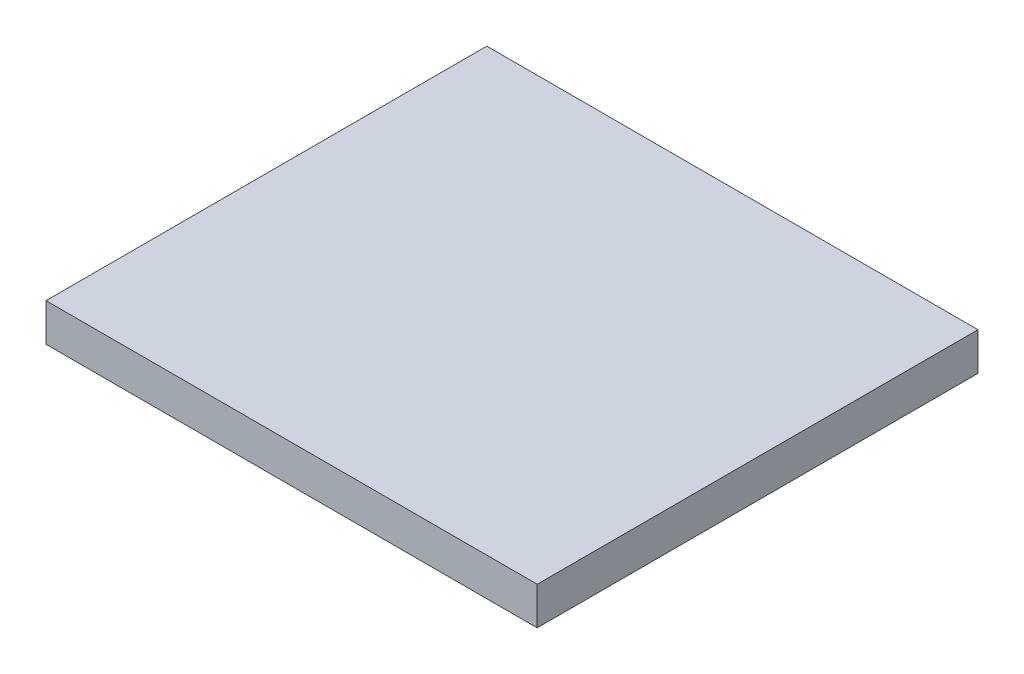
ISO-10303-21;
HEADER;
FILE_DESCRIPTION(('STEP AP214'),'2;1');
FILE_NAME('part.step','',(''),(''),'','','');
FILE_SCHEMA(('AUTOMOTIVE_DESIGN { 1 0 10303 214 1 1 1 1 }'));
ENDSEC;
DATA;
#1=APPLICATION_CONTEXT('core data for automotive mechanical design processes');
#2=APPLICATION_PROTOCOL_DEFINITION('international standard','automotive_design',2000,#1);
#3=PRODUCT_CONTEXT('',#1,'mechanical');
#4=PRODUCT('Part','Part','',(#3));
#5=PRODUCT_RELATED_PRODUCT_CATEGORY('part','',(#4));
#6=PRODUCT_DEFINITION_FORMATION('','',#4);
#7=PRODUCT_DEFINITION_CONTEXT('part definition',#1,'design');
#8=PRODUCT_DEFINITION('design','',#6,#7);
#9=PRODUCT_DEFINITION_SHAPE('','',#8);
#10=(LENGTH_UNIT() NAMED_UNIT(*) SI_UNIT(.MILLI.,.METRE.));
#11=(NAMED_UNIT(*) PLANE_ANGLE_UNIT() SI_UNIT($,.RADIAN.));
#12=(NAMED_UNIT(*) SI_UNIT($,.STERADIAN.) SOLID_ANGLE_UNIT());
#13=UNCERTAINTY_MEASURE_WITH_UNIT(LENGTH_MEASURE(1.E-05),#10,'distance_accuracy_value','');
#14=(GEOMETRIC_REPRESENTATION_CONTEXT(3) GLOBAL_UNCERTAINTY_ASSIGNED_CONTEXT((#13)) GLOBAL_UNIT_ASSIGNED_CONTEXT((#10,
#11,#12)) REPRESENTATION_CONTEXT('',''));
#15=CARTESIAN_POINT('',(0.,0.,0.));
#16=DIRECTION('',(0.,0.,1.));
#17=DIRECTION('',(1.,0.,0.));
#18=AXIS2_PLACEMENT_3D('',#15,#16,#17);
#19=CARTESIAN_POINT('',(-189.943820224719,6.,-52.5));
#20=DIRECTION('',(1.,0.,0.));
#21=DIRECTION('',(0.,0.,-1.));
#22=AXIS2_PLACEMENT_3D('',#19,#20,#21);
#23=PLANE('',#22);
#24=DIRECTION('',(0.,0.,1.));
#25=VECTOR('',#24,1.);
#26=CARTESIAN_POINT('',(-189.943820224719,0.,-52.5));
#27=LINE('',#26,#25);
#28=CARTESIAN_POINT('',(-189.943820224719,0.,-52.5));
#29=VERTEX_POINT('',#28);
#30=CARTESIAN_POINT('',(-189.943820224719,0.,17.5));
#31=VERTEX_POINT('',#30);
#32=EDGE_CURVE('E96',#29,#31,#27,.T.);
#33=ORIENTED_EDGE('',*,*,#32,.T.);
#34=DIRECTION('',(0.,-1.,0.));
#35=VECTOR('',#34,1.);
#36=CARTESIAN_POINT('',(-189.943820224719,6.,17.5));
#37=LINE('',#36,#35);
#38=CARTESIAN_POINT('',(-189.943820224719,6.,17.5));
#39=VERTEX_POINT('',#38);
#40=EDGE_CURVE('E11',#39,#31,#37,.T.);
#41=ORIENTED_EDGE('',*,*,#40,.F.);
#42=DIRECTION('',(0.,0.,1.));
#43=VECTOR('',#42,1.);
#44=CARTESIAN_POINT('',(-189.943820224719,6.,-52.5));
#45=LINE('',#44,#43);
#46=CARTESIAN_POINT('',(-189.943820224719,6.,-52.5));
#47=VERTEX_POINT('',#46);
#48=EDGE_CURVE('E84',#47,#39,#45,.T.);
#49=ORIENTED_EDGE('',*,*,#48,.F.);
#50=DIRECTION('',(0.,-1.,0.));
#51=VECTOR('',#50,1.);
#52=CARTESIAN_POINT('',(-189.943820224719,6.,-52.5));
#53=LINE('',#52,#51);
#54=EDGE_CURVE('E92',#47,#29,#53,.T.);
#55=ORIENTED_EDGE('',*,*,#54,.T.);
#56=EDGE_LOOP('',(#33,#41,#49,#55));
#57=FACE_BOUND('',#56,.T.);
#58=ADVANCED_FACE('F33',(#57),#23,.F.);
#59=CARTESIAN_POINT('',(-189.943820224719,6.,17.5));
#60=DIRECTION('',(0.,0.,-1.));
#61=DIRECTION('',(-1.,0.,0.));
#62=AXIS2_PLACEMENT_3D('',#59,#60,#61);
#63=PLANE('',#62);
#64=DIRECTION('',(1.,0.,0.));
#65=VECTOR('',#64,1.);
#66=CARTESIAN_POINT('',(-189.943820224719,0.,17.5));
#67=LINE('',#66,#65);
#68=CARTESIAN_POINT('',(-111.943820224719,0.,17.5));
#69=VERTEX_POINT('',#68);
#70=EDGE_CURVE('E88',#31,#69,#67,.T.);
#71=ORIENTED_EDGE('',*,*,#70,.T.);
#72=DIRECTION('',(0.,-1.,0.));
#73=VECTOR('',#72,1.);
#74=CARTESIAN_POINT('',(-111.943820224719,6.,17.5));
#75=LINE('',#74,#73);
#76=CARTESIAN_POINT('',(-111.943820224719,6.,17.5));
#77=VERTEX_POINT('',#76);
#78=EDGE_CURVE('E41',#77,#69,#75,.T.);
#79=ORIENTED_EDGE('',*,*,#78,.F.);
#80=DIRECTION('',(1.,0.,0.));
#81=VECTOR('',#80,1.);
#82=CARTESIAN_POINT('',(-189.943820224719,6.,17.5));
#83=LINE('',#82,#81);
#84=EDGE_CURVE('E79',#39,#77,#83,.T.);
#85=ORIENTED_EDGE('',*,*,#84,.F.);
#86=ORIENTED_EDGE('',*,*,#40,.T.);
#87=EDGE_LOOP('',(#71,#79,#85,#86));
#88=FACE_BOUND('',#87,.T.);
#89=ADVANCED_FACE('F87',(#88),#63,.F.);
#90=CARTESIAN_POINT('',(-111.943820224719,6.,-52.5));
#91=DIRECTION('',(-1.,0.,0.));
#92=DIRECTION('',(0.,0.,1.));
#93=AXIS2_PLACEMENT_3D('',#90,#91,#92);
#94=PLANE('',#93);
#95=DIRECTION('',(0.,0.,-1.));
#96=VECTOR('',#95,1.);
#97=CARTESIAN_POINT('',(-111.943820224719,0.,-52.5));
#98=LINE('',#97,#96);
#99=CARTESIAN_POINT('',(-111.943820224719,0.,-52.5));
#100=VERTEX_POINT('',#99);
#101=EDGE_CURVE('E66',#69,#100,#98,.T.);
#102=ORIENTED_EDGE('',*,*,#101,.T.);
#103=DIRECTION('',(0.,-1.,0.));
#104=VECTOR('',#103,1.);
#105=CARTESIAN_POINT('',(-111.943820224719,6.,-52.5));
#106=LINE('',#105,#104);
#107=CARTESIAN_POINT('',(-111.943820224719,6.,-52.5));
#108=VERTEX_POINT('',#107);
#109=EDGE_CURVE('E89',#108,#100,#106,.T.);
#110=ORIENTED_EDGE('',*,*,#109,.F.);
#111=DIRECTION('',(0.,0.,-1.));
#112=VECTOR('',#111,1.);
#113=CARTESIAN_POINT('',(-111.943820224719,6.,-52.5));
#114=LINE('',#113,#112);
#115=EDGE_CURVE('E82',#77,#108,#114,.T.);
#116=ORIENTED_EDGE('',*,*,#115,.F.);
#117=ORIENTED_EDGE('',*,*,#78,.T.);
#118=EDGE_LOOP('',(#102,#110,#116,#117));
#119=FACE_BOUND('',#118,.T.);
#120=ADVANCED_FACE('F90',(#119),#94,.F.);
#121=CARTESIAN_POINT('',(-189.943820224719,6.,-52.5));
#122=DIRECTION('',(0.,0.,1.));
#123=DIRECTION('',(1.,0.,0.));
#124=AXIS2_PLACEMENT_3D('',#121,#122,#123);
#125=PLANE('',#124);
#126=DIRECTION('',(-1.,0.,0.));
#127=VECTOR('',#126,1.);
#128=CARTESIAN_POINT('',(-189.943820224719,0.,-52.5));
#129=LINE('',#128,#127);
#130=EDGE_CURVE('E72',#100,#29,#129,.T.);
#131=ORIENTED_EDGE('',*,*,#130,.T.);
#132=ORIENTED_EDGE('',*,*,#54,.F.);
#133=DIRECTION('',(-1.,0.,0.));
#134=VECTOR('',#133,1.);
#135=CARTESIAN_POINT('',(-189.943820224719,6.,-52.5));
#136=LINE('',#135,#134);
#137=EDGE_CURVE('E49',#108,#47,#136,.T.);
#138=ORIENTED_EDGE('',*,*,#137,.F.);
#139=ORIENTED_EDGE('',*,*,#109,.T.);
#140=EDGE_LOOP('',(#131,#132,#138,#139));
#141=FACE_BOUND('',#140,.T.);
#142=ADVANCED_FACE('F103',(#141),#125,.F.);
#143=CARTESIAN_POINT('',(0.,6.,0.));
#144=DIRECTION('',(0.,1.,0.));
#145=DIRECTION('',(0.,0.,1.));
#146=AXIS2_PLACEMENT_3D('',#143,#144,#145);
#147=PLANE('',#146);
#148=ORIENTED_EDGE('',*,*,#48,.T.);
#149=ORIENTED_EDGE('',*,*,#84,.T.);
#150=ORIENTED_EDGE('',*,*,#115,.T.);
#151=ORIENTED_EDGE('',*,*,#137,.T.);
#152=EDGE_LOOP('',(#148,#149,#150,#151));
#153=FACE_BOUND('',#152,.T.);
#154=ADVANCED_FACE('F80',(#153),#147,.T.);
#155=CARTESIAN_POINT('',(0.,0.,0.));
#156=DIRECTION('',(0.,1.,0.));
#157=DIRECTION('',(0.,0.,1.));
#158=AXIS2_PLACEMENT_3D('',#155,#156,#157);
#159=PLANE('',#158);
#160=ORIENTED_EDGE('',*,*,#32,.F.);
#161=ORIENTED_EDGE('',*,*,#130,.F.);
#162=ORIENTED_EDGE('',*,*,#101,.F.);
#163=ORIENTED_EDGE('',*,*,#70,.F.);
#164=EDGE_LOOP('',(#160,#161,#162,#163));
#165=FACE_BOUND('',#164,.T.);
#166=ADVANCED_FACE('F106',(#165),#159,.F.);
#167=CLOSED_SHELL('',(#58,#89,#120,#142,#154,#166));
#168=MANIFOLD_SOLID_BREP('B2',#167);
#169=ADVANCED_BREP_SHAPE_REPRESENTATION('',(#18,#168),#14);
#170=SHAPE_DEFINITION_REPRESENTATION(#9,#169);
ENDSEC;
END-ISO-10303-21;
